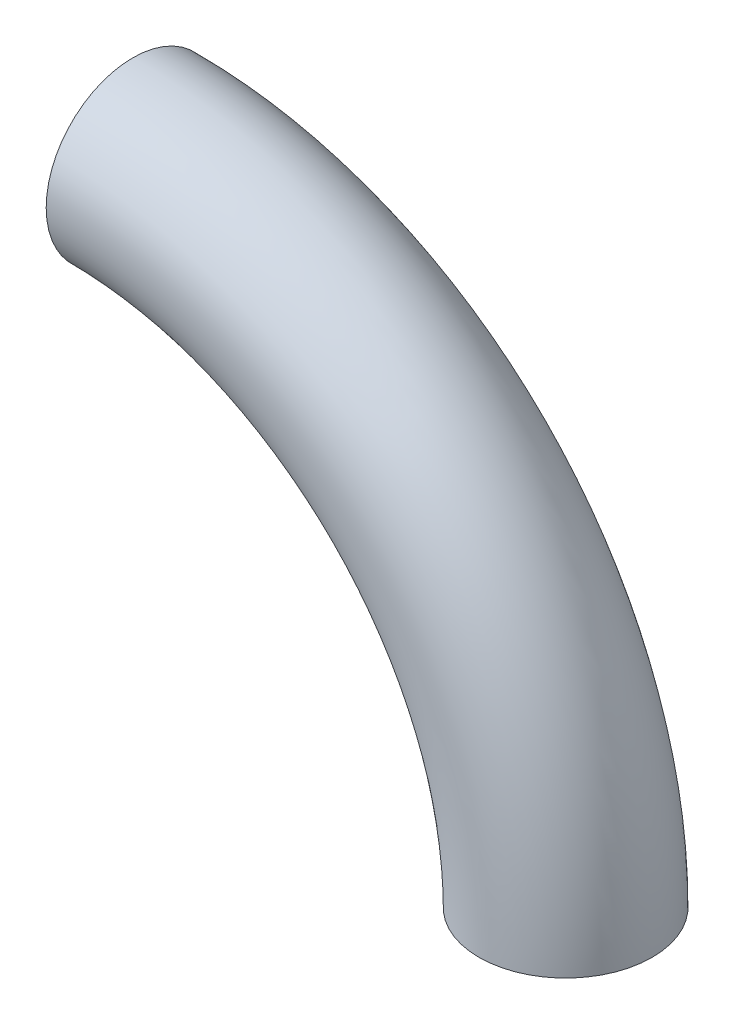
ISO-10303-21;
HEADER;
FILE_DESCRIPTION(('STEP AP214'),'2;1');
FILE_NAME('part.step','',(''),(''),'','','');
FILE_SCHEMA(('AUTOMOTIVE_DESIGN { 1 0 10303 214 1 1 1 1 }'));
ENDSEC;
DATA;
#1=APPLICATION_CONTEXT('core data for automotive mechanical design processes');
#2=APPLICATION_PROTOCOL_DEFINITION('international standard','automotive_design',2000,#1);
#3=PRODUCT_CONTEXT('',#1,'mechanical');
#4=PRODUCT('Part','Part','',(#3));
#5=PRODUCT_RELATED_PRODUCT_CATEGORY('part','',(#4));
#6=PRODUCT_DEFINITION_FORMATION('','',#4);
#7=PRODUCT_DEFINITION_CONTEXT('part definition',#1,'design');
#8=PRODUCT_DEFINITION('design','',#6,#7);
#9=PRODUCT_DEFINITION_SHAPE('','',#8);
#10=(LENGTH_UNIT() NAMED_UNIT(*) SI_UNIT(.MILLI.,.METRE.));
#11=(NAMED_UNIT(*) PLANE_ANGLE_UNIT() SI_UNIT($,.RADIAN.));
#12=(NAMED_UNIT(*) SI_UNIT($,.STERADIAN.) SOLID_ANGLE_UNIT());
#13=UNCERTAINTY_MEASURE_WITH_UNIT(LENGTH_MEASURE(1.E-05),#10,'distance_accuracy_value','');
#14=(GEOMETRIC_REPRESENTATION_CONTEXT(3) GLOBAL_UNCERTAINTY_ASSIGNED_CONTEXT((#13)) GLOBAL_UNIT_ASSIGNED_CONTEXT((#10,
#11,#12)) REPRESENTATION_CONTEXT('',''));
#15=CARTESIAN_POINT('',(0.,0.,0.));
#16=DIRECTION('',(0.,0.,1.));
#17=DIRECTION('',(1.,0.,0.));
#18=AXIS2_PLACEMENT_3D('',#15,#16,#17);
#19=CARTESIAN_POINT('',(0.,0.,0.));
#20=DIRECTION('',(0.,0.,-1.));
#21=DIRECTION('',(-1.,0.,0.));
#22=AXIS2_PLACEMENT_3D('',#19,#20,#21);
#23=TOROIDAL_SURFACE('',#22,20.,4.);
#24=CARTESIAN_POINT('',(0.,20.,0.));
#25=DIRECTION('',(1.,0.,0.));
#26=DIRECTION('',(0.,0.,-1.));
#27=AXIS2_PLACEMENT_3D('',#24,#25,#26);
#28=CIRCLE('',#27,4.);
#29=CARTESIAN_POINT('',(0.,24.,0.));
#30=VERTEX_POINT('',#29);
#31=EDGE_CURVE('E10',#30,#30,#28,.T.);
#32=CARTESIAN_POINT('',(20.,0.,0.));
#33=DIRECTION('',(0.,-1.,0.));
#34=DIRECTION('',(0.,0.,-1.));
#35=AXIS2_PLACEMENT_3D('',#32,#33,#34);
#36=CIRCLE('',#35,4.);
#37=CARTESIAN_POINT('',(24.,0.,0.));
#38=VERTEX_POINT('',#37);
#39=EDGE_CURVE('E43',#38,#38,#36,.T.);
#40=CARTESIAN_POINT('',(0.,0.,0.));
#41=DIRECTION('',(0.,0.,-1.));
#42=DIRECTION('',(-1.,0.,0.));
#43=AXIS2_PLACEMENT_3D('',#40,#41,#42);
#44=CIRCLE('',#43,24.);
#45=EDGE_CURVE('',#30,#38,#44,.T.);
#46=ORIENTED_EDGE('',*,*,#31,.T.);
#47=ORIENTED_EDGE('',*,*,#39,.F.);
#48=ORIENTED_EDGE('',*,*,#45,.T.);
#49=ORIENTED_EDGE('',*,*,#45,.F.);
#50=EDGE_LOOP('',(#46,#48,#47,#49));
#51=FACE_BOUND('',#50,.T.);
#52=ADVANCED_FACE('F37',(#51),#23,.T.);
#53=CARTESIAN_POINT('',(0.,20.,0.));
#54=DIRECTION('',(1.,0.,0.));
#55=DIRECTION('',(0.,0.,-1.));
#56=AXIS2_PLACEMENT_3D('',#53,#54,#55);
#57=PLANE('',#56);
#58=ORIENTED_EDGE('',*,*,#31,.F.);
#59=EDGE_LOOP('',(#58));
#60=FACE_BOUND('',#59,.T.);
#61=ADVANCED_FACE('F52',(#60),#57,.F.);
#62=CARTESIAN_POINT('',(20.,0.,0.));
#63=DIRECTION('',(0.,-1.,0.));
#64=DIRECTION('',(0.,0.,-1.));
#65=AXIS2_PLACEMENT_3D('',#62,#63,#64);
#66=PLANE('',#65);
#67=ORIENTED_EDGE('',*,*,#39,.T.);
#68=EDGE_LOOP('',(#67));
#69=FACE_BOUND('',#68,.T.);
#70=ADVANCED_FACE('F49',(#69),#66,.T.);
#71=CLOSED_SHELL('',(#52,#61,#70));
#72=MANIFOLD_SOLID_BREP('B2',#71);
#73=ADVANCED_BREP_SHAPE_REPRESENTATION('',(#18,#72),#14);
#74=SHAPE_DEFINITION_REPRESENTATION(#9,#73);
ENDSEC;
END-ISO-10303-21;
